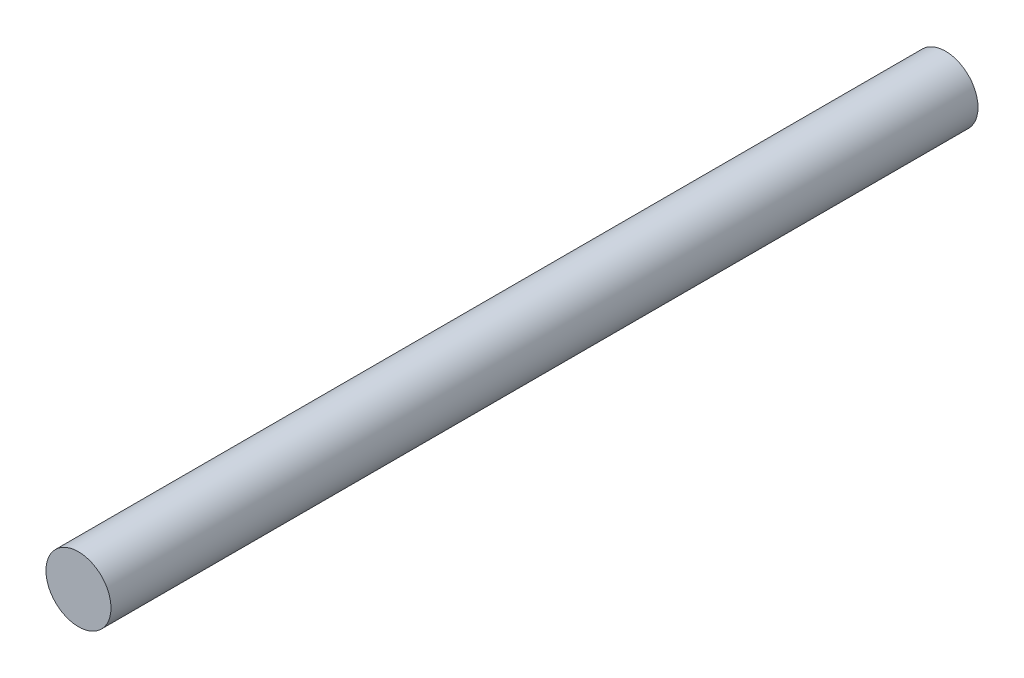
ISO-10303-21;
HEADER;
FILE_DESCRIPTION(('STEP AP214'),'2;1');
FILE_NAME('part.step','',(''),(''),'','','');
FILE_SCHEMA(('AUTOMOTIVE_DESIGN { 1 0 10303 214 1 1 1 1 }'));
ENDSEC;
DATA;
#1=APPLICATION_CONTEXT('core data for automotive mechanical design processes');
#2=APPLICATION_PROTOCOL_DEFINITION('international standard','automotive_design',2000,#1);
#3=PRODUCT_CONTEXT('',#1,'mechanical');
#4=PRODUCT('Part','Part','',(#3));
#5=PRODUCT_RELATED_PRODUCT_CATEGORY('part','',(#4));
#6=PRODUCT_DEFINITION_FORMATION('','',#4);
#7=PRODUCT_DEFINITION_CONTEXT('part definition',#1,'design');
#8=PRODUCT_DEFINITION('design','',#6,#7);
#9=PRODUCT_DEFINITION_SHAPE('','',#8);
#10=(LENGTH_UNIT() NAMED_UNIT(*) SI_UNIT(.MILLI.,.METRE.));
#11=(NAMED_UNIT(*) PLANE_ANGLE_UNIT() SI_UNIT($,.RADIAN.));
#12=(NAMED_UNIT(*) SI_UNIT($,.STERADIAN.) SOLID_ANGLE_UNIT());
#13=UNCERTAINTY_MEASURE_WITH_UNIT(LENGTH_MEASURE(1.E-05),#10,'distance_accuracy_value','');
#14=(GEOMETRIC_REPRESENTATION_CONTEXT(3) GLOBAL_UNCERTAINTY_ASSIGNED_CONTEXT((#13)) GLOBAL_UNIT_ASSIGNED_CONTEXT((#10,
#11,#12)) REPRESENTATION_CONTEXT('',''));
#15=CARTESIAN_POINT('',(0.,0.,0.));
#16=DIRECTION('',(0.,0.,1.));
#17=DIRECTION('',(1.,0.,0.));
#18=AXIS2_PLACEMENT_3D('',#15,#16,#17);
#19=CARTESIAN_POINT('',(0.,0.,80.));
#20=DIRECTION('',(0.,0.,-1.));
#21=DIRECTION('',(-1.,0.,0.));
#22=AXIS2_PLACEMENT_3D('',#19,#20,#21);
#23=CYLINDRICAL_SURFACE('',#22,3.);
#24=CARTESIAN_POINT('',(0.,0.,80.));
#25=DIRECTION('',(0.,0.,1.));
#26=DIRECTION('',(1.,0.,0.));
#27=AXIS2_PLACEMENT_3D('',#24,#25,#26);
#28=CIRCLE('',#27,3.);
#29=CARTESIAN_POINT('',(3.,0.,80.));
#30=VERTEX_POINT('',#29);
#31=EDGE_CURVE('E10',#30,#30,#28,.T.);
#32=ORIENTED_EDGE('',*,*,#31,.F.);
#33=EDGE_LOOP('',(#32));
#34=FACE_BOUND('',#33,.T.);
#35=CARTESIAN_POINT('',(0.,0.,0.));
#36=DIRECTION('',(0.,0.,1.));
#37=DIRECTION('',(1.,0.,0.));
#38=AXIS2_PLACEMENT_3D('',#35,#36,#37);
#39=CIRCLE('',#38,3.);
#40=CARTESIAN_POINT('',(3.,0.,0.));
#41=VERTEX_POINT('',#40);
#42=EDGE_CURVE('E34',#41,#41,#39,.T.);
#43=ORIENTED_EDGE('',*,*,#42,.T.);
#44=EDGE_LOOP('',(#43));
#45=FACE_BOUND('',#44,.T.);
#46=ADVANCED_FACE('F31',(#34,#45),#23,.T.);
#47=CARTESIAN_POINT('',(0.,0.,80.));
#48=DIRECTION('',(0.,0.,1.));
#49=DIRECTION('',(1.,0.,0.));
#50=AXIS2_PLACEMENT_3D('',#47,#48,#49);
#51=PLANE('',#50);
#52=ORIENTED_EDGE('',*,*,#31,.T.);
#53=EDGE_LOOP('',(#52));
#54=FACE_BOUND('',#53,.T.);
#55=ADVANCED_FACE('F46',(#54),#51,.T.);
#56=CARTESIAN_POINT('',(0.,0.,0.));
#57=DIRECTION('',(0.,0.,1.));
#58=DIRECTION('',(1.,0.,0.));
#59=AXIS2_PLACEMENT_3D('',#56,#57,#58);
#60=PLANE('',#59);
#61=ORIENTED_EDGE('',*,*,#42,.F.);
#62=EDGE_LOOP('',(#61));
#63=FACE_BOUND('',#62,.T.);
#64=ADVANCED_FACE('F44',(#63),#60,.F.);
#65=CLOSED_SHELL('',(#46,#55,#64));
#66=MANIFOLD_SOLID_BREP('B2',#65);
#67=ADVANCED_BREP_SHAPE_REPRESENTATION('',(#18,#66),#14);
#68=SHAPE_DEFINITION_REPRESENTATION(#9,#67);
ENDSEC;
END-ISO-10303-21;
